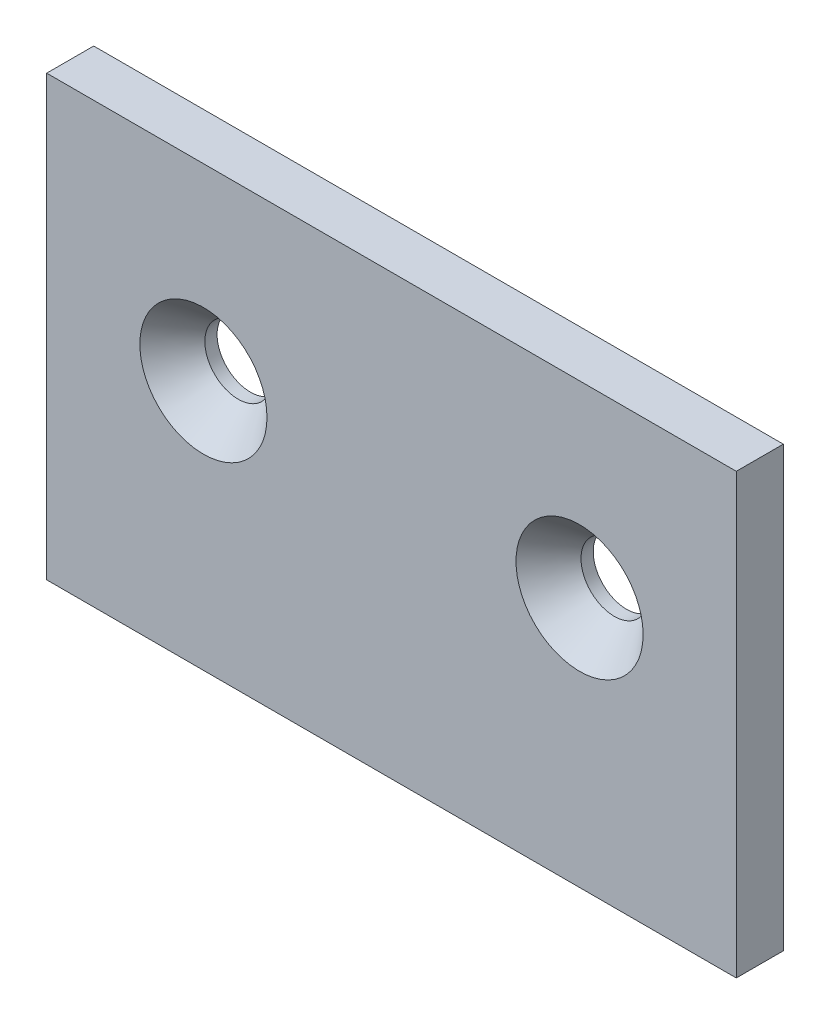
ISO-10303-21;
HEADER;
FILE_DESCRIPTION(('STEP AP214'),'2;1');
FILE_NAME('part.step','',(''),(''),'','','');
FILE_SCHEMA(('AUTOMOTIVE_DESIGN { 1 0 10303 214 1 1 1 1 }'));
ENDSEC;
DATA;
#1=APPLICATION_CONTEXT('core data for automotive mechanical design processes');
#2=APPLICATION_PROTOCOL_DEFINITION('international standard','automotive_design',2000,#1);
#3=PRODUCT_CONTEXT('',#1,'mechanical');
#4=PRODUCT('Part','Part','',(#3));
#5=PRODUCT_RELATED_PRODUCT_CATEGORY('part','',(#4));
#6=PRODUCT_DEFINITION_FORMATION('','',#4);
#7=PRODUCT_DEFINITION_CONTEXT('part definition',#1,'design');
#8=PRODUCT_DEFINITION('design','',#6,#7);
#9=PRODUCT_DEFINITION_SHAPE('','',#8);
#10=(LENGTH_UNIT() NAMED_UNIT(*) SI_UNIT(.MILLI.,.METRE.));
#11=(NAMED_UNIT(*) PLANE_ANGLE_UNIT() SI_UNIT($,.RADIAN.));
#12=(NAMED_UNIT(*) SI_UNIT($,.STERADIAN.) SOLID_ANGLE_UNIT());
#13=UNCERTAINTY_MEASURE_WITH_UNIT(LENGTH_MEASURE(1.E-05),#10,'distance_accuracy_value','');
#14=(GEOMETRIC_REPRESENTATION_CONTEXT(3) GLOBAL_UNCERTAINTY_ASSIGNED_CONTEXT((#13)) GLOBAL_UNIT_ASSIGNED_CONTEXT((#10,
#11,#12)) REPRESENTATION_CONTEXT('',''));
#15=CARTESIAN_POINT('',(0.,0.,0.));
#16=DIRECTION('',(0.,0.,1.));
#17=DIRECTION('',(1.,0.,0.));
#18=AXIS2_PLACEMENT_3D('',#15,#16,#17);
#19=CARTESIAN_POINT('',(0.,0.,4.7625));
#20=DIRECTION('',(1.,0.,0.));
#21=DIRECTION('',(0.,0.,-1.));
#22=AXIS2_PLACEMENT_3D('',#19,#20,#21);
#23=PLANE('',#22);
#24=DIRECTION('',(0.,-1.,0.));
#25=VECTOR('',#24,1.);
#26=CARTESIAN_POINT('',(0.,0.,0.));
#27=LINE('',#26,#25);
#28=CARTESIAN_POINT('',(0.,44.45,0.));
#29=VERTEX_POINT('',#28);
#30=CARTESIAN_POINT('',(0.,0.,0.));
#31=VERTEX_POINT('',#30);
#32=EDGE_CURVE('E95',#29,#31,#27,.T.);
#33=ORIENTED_EDGE('',*,*,#32,.T.);
#34=DIRECTION('',(0.,0.,-1.));
#35=VECTOR('',#34,1.);
#36=CARTESIAN_POINT('',(0.,0.,4.7625));
#37=LINE('',#36,#35);
#38=CARTESIAN_POINT('',(0.,0.,4.7625));
#39=VERTEX_POINT('',#38);
#40=EDGE_CURVE('E11',#39,#31,#37,.T.);
#41=ORIENTED_EDGE('',*,*,#40,.F.);
#42=DIRECTION('',(0.,-1.,0.));
#43=VECTOR('',#42,1.);
#44=CARTESIAN_POINT('',(0.,0.,4.7625));
#45=LINE('',#44,#43);
#46=CARTESIAN_POINT('',(0.,44.45,4.7625));
#47=VERTEX_POINT('',#46);
#48=EDGE_CURVE('E83',#47,#39,#45,.T.);
#49=ORIENTED_EDGE('',*,*,#48,.F.);
#50=DIRECTION('',(0.,0.,-1.));
#51=VECTOR('',#50,1.);
#52=CARTESIAN_POINT('',(0.,44.45,4.7625));
#53=LINE('',#52,#51);
#54=EDGE_CURVE('E91',#47,#29,#53,.T.);
#55=ORIENTED_EDGE('',*,*,#54,.T.);
#56=EDGE_LOOP('',(#33,#41,#49,#55));
#57=FACE_BOUND('',#56,.T.);
#58=ADVANCED_FACE('F32',(#57),#23,.F.);
#59=CARTESIAN_POINT('',(0.,0.,4.7625));
#60=DIRECTION('',(0.,1.,0.));
#61=DIRECTION('',(0.,0.,1.));
#62=AXIS2_PLACEMENT_3D('',#59,#60,#61);
#63=PLANE('',#62);
#64=DIRECTION('',(1.,0.,0.));
#65=VECTOR('',#64,1.);
#66=CARTESIAN_POINT('',(0.,0.,0.));
#67=LINE('',#66,#65);
#68=CARTESIAN_POINT('',(69.85,0.,0.));
#69=VERTEX_POINT('',#68);
#70=EDGE_CURVE('E87',#31,#69,#67,.T.);
#71=ORIENTED_EDGE('',*,*,#70,.T.);
#72=DIRECTION('',(0.,0.,-1.));
#73=VECTOR('',#72,1.);
#74=CARTESIAN_POINT('',(69.85,0.,4.7625));
#75=LINE('',#74,#73);
#76=CARTESIAN_POINT('',(69.85,0.,4.7625));
#77=VERTEX_POINT('',#76);
#78=EDGE_CURVE('E40',#77,#69,#75,.T.);
#79=ORIENTED_EDGE('',*,*,#78,.F.);
#80=DIRECTION('',(1.,0.,0.));
#81=VECTOR('',#80,1.);
#82=CARTESIAN_POINT('',(0.,0.,4.7625));
#83=LINE('',#82,#81);
#84=EDGE_CURVE('E78',#39,#77,#83,.T.);
#85=ORIENTED_EDGE('',*,*,#84,.F.);
#86=ORIENTED_EDGE('',*,*,#40,.T.);
#87=EDGE_LOOP('',(#71,#79,#85,#86));
#88=FACE_BOUND('',#87,.T.);
#89=ADVANCED_FACE('F86',(#88),#63,.F.);
#90=CARTESIAN_POINT('',(69.85,0.,4.7625));
#91=DIRECTION('',(-1.,0.,0.));
#92=DIRECTION('',(0.,0.,1.));
#93=AXIS2_PLACEMENT_3D('',#90,#91,#92);
#94=PLANE('',#93);
#95=DIRECTION('',(0.,1.,0.));
#96=VECTOR('',#95,1.);
#97=CARTESIAN_POINT('',(69.85,0.,0.));
#98=LINE('',#97,#96);
#99=CARTESIAN_POINT('',(69.85,44.45,0.));
#100=VERTEX_POINT('',#99);
#101=EDGE_CURVE('E65',#69,#100,#98,.T.);
#102=ORIENTED_EDGE('',*,*,#101,.T.);
#103=DIRECTION('',(0.,0.,-1.));
#104=VECTOR('',#103,1.);
#105=CARTESIAN_POINT('',(69.85,44.45,4.7625));
#106=LINE('',#105,#104);
#107=CARTESIAN_POINT('',(69.85,44.45,4.7625));
#108=VERTEX_POINT('',#107);
#109=EDGE_CURVE('E88',#108,#100,#106,.T.);
#110=ORIENTED_EDGE('',*,*,#109,.F.);
#111=DIRECTION('',(0.,1.,0.));
#112=VECTOR('',#111,1.);
#113=CARTESIAN_POINT('',(69.85,0.,4.7625));
#114=LINE('',#113,#112);
#115=EDGE_CURVE('E81',#77,#108,#114,.T.);
#116=ORIENTED_EDGE('',*,*,#115,.F.);
#117=ORIENTED_EDGE('',*,*,#78,.T.);
#118=EDGE_LOOP('',(#102,#110,#116,#117));
#119=FACE_BOUND('',#118,.T.);
#120=ADVANCED_FACE('F89',(#119),#94,.F.);
#121=CARTESIAN_POINT('',(0.,44.45,4.7625));
#122=DIRECTION('',(0.,-1.,0.));
#123=DIRECTION('',(0.,0.,-1.));
#124=AXIS2_PLACEMENT_3D('',#121,#122,#123);
#125=PLANE('',#124);
#126=DIRECTION('',(-1.,0.,0.));
#127=VECTOR('',#126,1.);
#128=CARTESIAN_POINT('',(0.,44.45,0.));
#129=LINE('',#128,#127);
#130=EDGE_CURVE('E71',#100,#29,#129,.T.);
#131=ORIENTED_EDGE('',*,*,#130,.T.);
#132=ORIENTED_EDGE('',*,*,#54,.F.);
#133=DIRECTION('',(-1.,0.,0.));
#134=VECTOR('',#133,1.);
#135=CARTESIAN_POINT('',(0.,44.45,4.7625));
#136=LINE('',#135,#134);
#137=EDGE_CURVE('E48',#108,#47,#136,.T.);
#138=ORIENTED_EDGE('',*,*,#137,.F.);
#139=ORIENTED_EDGE('',*,*,#109,.T.);
#140=EDGE_LOOP('',(#131,#132,#138,#139));
#141=FACE_BOUND('',#140,.T.);
#142=ADVANCED_FACE('F103',(#141),#125,.F.);
#143=CARTESIAN_POINT('',(0.,0.,4.7625));
#144=DIRECTION('',(0.,0.,-1.));
#145=DIRECTION('',(-1.,0.,0.));
#146=AXIS2_PLACEMENT_3D('',#143,#144,#145);
#147=PLANE('',#146);
#148=CARTESIAN_POINT('',(15.875,25.4,4.7625));
#149=DIRECTION('',(0.,0.,1.));
#150=DIRECTION('',(1.,0.,0.));
#151=AXIS2_PLACEMENT_3D('',#148,#149,#150);
#152=CIRCLE('',#151,6.4389);
#153=CARTESIAN_POINT('',(22.3139,25.4,4.7625));
#154=VERTEX_POINT('',#153);
#155=EDGE_CURVE('E123',#154,#154,#152,.T.);
#156=ORIENTED_EDGE('',*,*,#155,.F.);
#157=EDGE_LOOP('',(#156));
#158=FACE_BOUND('',#157,.T.);
#159=CARTESIAN_POINT('',(53.975,25.4,4.7625));
#160=DIRECTION('',(0.,0.,1.));
#161=DIRECTION('',(1.,0.,0.));
#162=AXIS2_PLACEMENT_3D('',#159,#160,#161);
#163=CIRCLE('',#162,6.4389);
#164=CARTESIAN_POINT('',(60.4139,25.4,4.7625));
#165=VERTEX_POINT('',#164);
#166=EDGE_CURVE('E114',#165,#165,#163,.T.);
#167=ORIENTED_EDGE('',*,*,#166,.F.);
#168=EDGE_LOOP('',(#167));
#169=FACE_BOUND('',#168,.T.);
#170=ORIENTED_EDGE('',*,*,#48,.T.);
#171=ORIENTED_EDGE('',*,*,#84,.T.);
#172=ORIENTED_EDGE('',*,*,#115,.T.);
#173=ORIENTED_EDGE('',*,*,#137,.T.);
#174=EDGE_LOOP('',(#170,#171,#172,#173));
#175=FACE_BOUND('',#174,.T.);
#176=ADVANCED_FACE('F79',(#158,#169,#175),#147,.F.);
#177=CARTESIAN_POINT('',(0.,0.,0.));
#178=DIRECTION('',(0.,0.,-1.));
#179=DIRECTION('',(-1.,0.,0.));
#180=AXIS2_PLACEMENT_3D('',#177,#178,#179);
#181=PLANE('',#180);
#182=CARTESIAN_POINT('',(15.875,25.4,0.));
#183=DIRECTION('',(0.,0.,1.));
#184=DIRECTION('',(1.,0.,0.));
#185=AXIS2_PLACEMENT_3D('',#182,#183,#184);
#186=CIRCLE('',#185,3.3782);
#187=CARTESIAN_POINT('',(19.2532,25.4,0.));
#188=VERTEX_POINT('',#187);
#189=EDGE_CURVE('E117',#188,#188,#186,.T.);
#190=ORIENTED_EDGE('',*,*,#189,.T.);
#191=EDGE_LOOP('',(#190));
#192=FACE_BOUND('',#191,.T.);
#193=CARTESIAN_POINT('',(53.975,25.4,0.));
#194=DIRECTION('',(0.,0.,1.));
#195=DIRECTION('',(1.,0.,0.));
#196=AXIS2_PLACEMENT_3D('',#193,#194,#195);
#197=CIRCLE('',#196,3.3782);
#198=CARTESIAN_POINT('',(57.3532,25.4,0.));
#199=VERTEX_POINT('',#198);
#200=EDGE_CURVE('E98',#199,#199,#197,.T.);
#201=ORIENTED_EDGE('',*,*,#200,.T.);
#202=EDGE_LOOP('',(#201));
#203=FACE_BOUND('',#202,.T.);
#204=ORIENTED_EDGE('',*,*,#32,.F.);
#205=ORIENTED_EDGE('',*,*,#130,.F.);
#206=ORIENTED_EDGE('',*,*,#101,.F.);
#207=ORIENTED_EDGE('',*,*,#70,.F.);
#208=EDGE_LOOP('',(#204,#205,#206,#207));
#209=FACE_BOUND('',#208,.T.);
#210=ADVANCED_FACE('F106',(#192,#203,#209),#181,.T.);
#211=CARTESIAN_POINT('',(53.975,25.4,4.7625));
#212=DIRECTION('',(0.,0.,1.));
#213=DIRECTION('',(1.,0.,0.));
#214=AXIS2_PLACEMENT_3D('',#211,#212,#213);
#215=CYLINDRICAL_SURFACE('',#214,3.3782);
#216=ORIENTED_EDGE('',*,*,#200,.F.);
#217=EDGE_LOOP('',(#216));
#218=FACE_BOUND('',#217,.T.);
#219=CARTESIAN_POINT('',(53.975,25.4,1.24156741601866));
#220=DIRECTION('',(0.,0.,1.));
#221=DIRECTION('',(1.,0.,0.));
#222=AXIS2_PLACEMENT_3D('',#219,#220,#221);
#223=CIRCLE('',#222,3.3782);
#224=CARTESIAN_POINT('',(57.3532,25.4,1.24156741601866));
#225=VERTEX_POINT('',#224);
#226=EDGE_CURVE('E111',#225,#225,#223,.T.);
#227=ORIENTED_EDGE('',*,*,#226,.T.);
#228=EDGE_LOOP('',(#227));
#229=FACE_BOUND('',#228,.T.);
#230=ADVANCED_FACE('F137',(#218,#229),#215,.F.);
#231=CARTESIAN_POINT('',(53.975,25.4,4.7625));
#232=DIRECTION('',(0.,0.,1.));
#233=DIRECTION('',(1.,0.,0.));
#234=AXIS2_PLACEMENT_3D('',#231,#232,#233);
#235=CONICAL_SURFACE('',#234,6.4389,0.715584993317675);
#236=ORIENTED_EDGE('',*,*,#226,.F.);
#237=EDGE_LOOP('',(#236));
#238=FACE_BOUND('',#237,.T.);
#239=ORIENTED_EDGE('',*,*,#166,.T.);
#240=EDGE_LOOP('',(#239));
#241=FACE_BOUND('',#240,.T.);
#242=ADVANCED_FACE('F134',(#238,#241),#235,.F.);
#243=CARTESIAN_POINT('',(15.875,25.4,4.7625));
#244=DIRECTION('',(0.,0.,1.));
#245=DIRECTION('',(1.,0.,0.));
#246=AXIS2_PLACEMENT_3D('',#243,#244,#245);
#247=CYLINDRICAL_SURFACE('',#246,3.3782);
#248=ORIENTED_EDGE('',*,*,#189,.F.);
#249=EDGE_LOOP('',(#248));
#250=FACE_BOUND('',#249,.T.);
#251=CARTESIAN_POINT('',(15.875,25.4,1.24156741601866));
#252=DIRECTION('',(0.,0.,1.));
#253=DIRECTION('',(1.,0.,0.));
#254=AXIS2_PLACEMENT_3D('',#251,#252,#253);
#255=CIRCLE('',#254,3.3782);
#256=CARTESIAN_POINT('',(19.2532,25.4,1.24156741601866));
#257=VERTEX_POINT('',#256);
#258=EDGE_CURVE('E120',#257,#257,#255,.T.);
#259=ORIENTED_EDGE('',*,*,#258,.T.);
#260=EDGE_LOOP('',(#259));
#261=FACE_BOUND('',#260,.T.);
#262=ADVANCED_FACE('F136',(#250,#261),#247,.F.);
#263=CARTESIAN_POINT('',(15.875,25.4,4.7625));
#264=DIRECTION('',(0.,0.,1.));
#265=DIRECTION('',(1.,0.,0.));
#266=AXIS2_PLACEMENT_3D('',#263,#264,#265);
#267=CONICAL_SURFACE('',#266,6.4389,0.715584993317675);
#268=ORIENTED_EDGE('',*,*,#258,.F.);
#269=EDGE_LOOP('',(#268));
#270=FACE_BOUND('',#269,.T.);
#271=ORIENTED_EDGE('',*,*,#155,.T.);
#272=EDGE_LOOP('',(#271));
#273=FACE_BOUND('',#272,.T.);
#274=ADVANCED_FACE('F127',(#270,#273),#267,.F.);
#275=CLOSED_SHELL('',(#58,#89,#120,#142,#176,#210,#230,#242,#262,#274));
#276=MANIFOLD_SOLID_BREP('B2',#275);
#277=ADVANCED_BREP_SHAPE_REPRESENTATION('',(#18,#276),#14);
#278=SHAPE_DEFINITION_REPRESENTATION(#9,#277);
ENDSEC;
END-ISO-10303-21;
